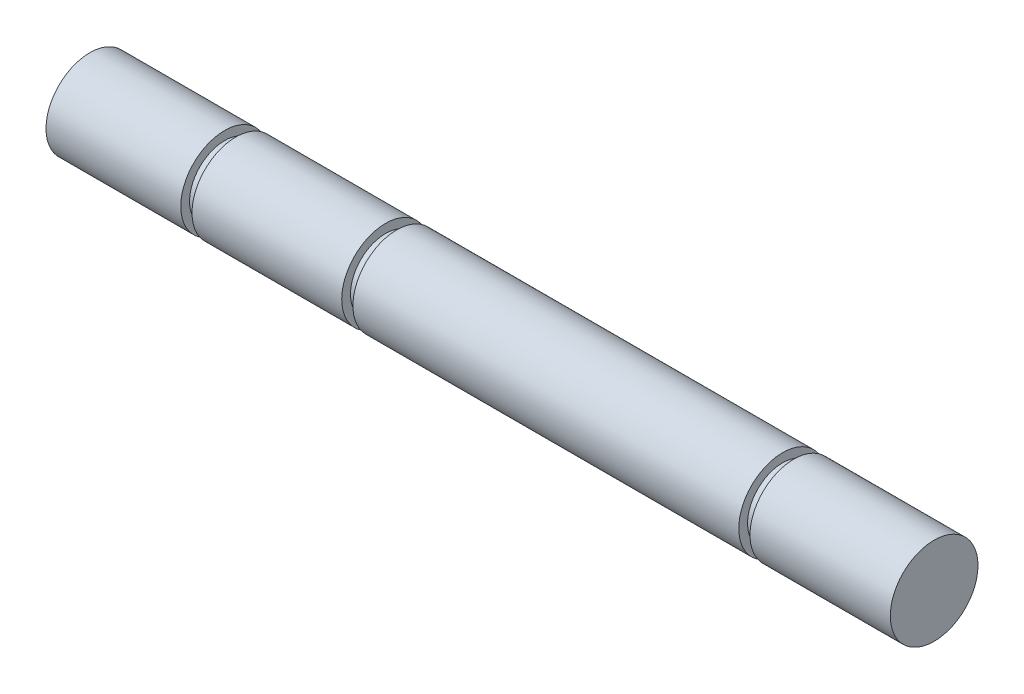
ISO-10303-21;
HEADER;
FILE_DESCRIPTION(('STEP AP214'),'2;1');
FILE_NAME('part.step','',(''),(''),'','','');
FILE_SCHEMA(('AUTOMOTIVE_DESIGN { 1 0 10303 214 1 1 1 1 }'));
ENDSEC;
DATA;
#1=APPLICATION_CONTEXT('core data for automotive mechanical design processes');
#2=APPLICATION_PROTOCOL_DEFINITION('international standard','automotive_design',2000,#1);
#3=PRODUCT_CONTEXT('',#1,'mechanical');
#4=PRODUCT('Part','Part','',(#3));
#5=PRODUCT_RELATED_PRODUCT_CATEGORY('part','',(#4));
#6=PRODUCT_DEFINITION_FORMATION('','',#4);
#7=PRODUCT_DEFINITION_CONTEXT('part definition',#1,'design');
#8=PRODUCT_DEFINITION('design','',#6,#7);
#9=PRODUCT_DEFINITION_SHAPE('','',#8);
#10=(LENGTH_UNIT() NAMED_UNIT(*) SI_UNIT(.MILLI.,.METRE.));
#11=(NAMED_UNIT(*) PLANE_ANGLE_UNIT() SI_UNIT($,.RADIAN.));
#12=(NAMED_UNIT(*) SI_UNIT($,.STERADIAN.) SOLID_ANGLE_UNIT());
#13=UNCERTAINTY_MEASURE_WITH_UNIT(LENGTH_MEASURE(1.E-05),#10,'distance_accuracy_value','');
#14=(GEOMETRIC_REPRESENTATION_CONTEXT(3) GLOBAL_UNCERTAINTY_ASSIGNED_CONTEXT((#13)) GLOBAL_UNIT_ASSIGNED_CONTEXT((#10,
#11,#12)) REPRESENTATION_CONTEXT('',''));
#15=CARTESIAN_POINT('',(0.,0.,0.));
#16=DIRECTION('',(0.,0.,1.));
#17=DIRECTION('',(1.,0.,0.));
#18=AXIS2_PLACEMENT_3D('',#15,#16,#17);
#19=CARTESIAN_POINT('',(100.,0.,0.));
#20=DIRECTION('',(-1.,0.,0.));
#21=DIRECTION('',(0.,0.,1.));
#22=AXIS2_PLACEMENT_3D('',#19,#20,#21);
#23=CYLINDRICAL_SURFACE('',#22,2.5);
#24=CARTESIAN_POINT('',(68.72,0.,0.));
#25=DIRECTION('',(1.,0.,0.));
#26=DIRECTION('',(0.,0.,-1.));
#27=AXIS2_PLACEMENT_3D('',#24,#25,#26);
#28=CIRCLE('',#27,2.5);
#29=CARTESIAN_POINT('',(68.72,0.,-2.5));
#30=VERTEX_POINT('',#29);
#31=EDGE_CURVE('E56',#30,#30,#28,.T.);
#32=ORIENTED_EDGE('',*,*,#31,.F.);
#33=EDGE_LOOP('',(#32));
#34=FACE_BOUND('',#33,.T.);
#35=CARTESIAN_POINT('',(60.185,0.,0.));
#36=DIRECTION('',(-1.,0.,0.));
#37=DIRECTION('',(0.,0.,1.));
#38=AXIS2_PLACEMENT_3D('',#35,#36,#37);
#39=CIRCLE('',#38,2.5);
#40=CARTESIAN_POINT('',(60.185,0.,2.5));
#41=VERTEX_POINT('',#40);
#42=EDGE_CURVE('E74',#41,#41,#39,.T.);
#43=ORIENTED_EDGE('',*,*,#42,.F.);
#44=EDGE_LOOP('',(#43));
#45=FACE_BOUND('',#44,.T.);
#46=ADVANCED_FACE('F35',(#34,#45),#23,.T.);
#47=CARTESIAN_POINT('',(69.36,0.,0.));
#48=DIRECTION('',(1.,0.,0.));
#49=DIRECTION('',(0.,0.,-1.));
#50=AXIS2_PLACEMENT_3D('',#47,#48,#49);
#51=CIRCLE('',#50,2.5);
#52=CARTESIAN_POINT('',(69.36,0.,-2.5));
#53=VERTEX_POINT('',#52);
#54=EDGE_CURVE('E59',#53,#53,#51,.T.);
#55=ORIENTED_EDGE('',*,*,#54,.T.);
#56=EDGE_LOOP('',(#55));
#57=FACE_BOUND('',#56,.T.);
#58=CARTESIAN_POINT('',(91.36,0.,0.));
#59=DIRECTION('',(1.,0.,0.));
#60=DIRECTION('',(0.,0.,-1.));
#61=AXIS2_PLACEMENT_3D('',#58,#59,#60);
#62=CIRCLE('',#61,2.5);
#63=CARTESIAN_POINT('',(91.36,0.,-2.5));
#64=VERTEX_POINT('',#63);
#65=EDGE_CURVE('E42',#64,#64,#62,.T.);
#66=ORIENTED_EDGE('',*,*,#65,.F.);
#67=EDGE_LOOP('',(#66));
#68=FACE_BOUND('',#67,.T.);
#69=ADVANCED_FACE('F107',(#57,#68),#23,.T.);
#70=CARTESIAN_POINT('',(91.36,0.,0.));
#71=DIRECTION('',(1.,0.,0.));
#72=DIRECTION('',(0.,0.,-1.));
#73=AXIS2_PLACEMENT_3D('',#70,#71,#72);
#74=PLANE('',#73);
#75=CARTESIAN_POINT('',(91.36,0.,0.));
#76=DIRECTION('',(1.,0.,0.));
#77=DIRECTION('',(0.,0.,-1.));
#78=AXIS2_PLACEMENT_3D('',#75,#76,#77);
#79=CIRCLE('',#78,2.);
#80=CARTESIAN_POINT('',(91.36,0.,-2.));
#81=VERTEX_POINT('',#80);
#82=EDGE_CURVE('E51',#81,#81,#79,.T.);
#83=ORIENTED_EDGE('',*,*,#82,.F.);
#84=EDGE_LOOP('',(#83));
#85=FACE_BOUND('',#84,.T.);
#86=ORIENTED_EDGE('',*,*,#65,.T.);
#87=EDGE_LOOP('',(#86));
#88=FACE_BOUND('',#87,.T.);
#89=ADVANCED_FACE('F113',(#85,#88),#74,.T.);
#90=CARTESIAN_POINT('',(92.,0.,0.));
#91=DIRECTION('',(1.,0.,0.));
#92=DIRECTION('',(0.,0.,-1.));
#93=AXIS2_PLACEMENT_3D('',#90,#91,#92);
#94=PLANE('',#93);
#95=CARTESIAN_POINT('',(92.,0.,0.));
#96=DIRECTION('',(1.,0.,0.));
#97=DIRECTION('',(0.,0.,-1.));
#98=AXIS2_PLACEMENT_3D('',#95,#96,#97);
#99=CIRCLE('',#98,2.);
#100=CARTESIAN_POINT('',(92.,0.,-2.));
#101=VERTEX_POINT('',#100);
#102=EDGE_CURVE('E53',#101,#101,#99,.T.);
#103=ORIENTED_EDGE('',*,*,#102,.T.);
#104=EDGE_LOOP('',(#103));
#105=FACE_BOUND('',#104,.T.);
#106=CARTESIAN_POINT('',(92.,0.,0.));
#107=DIRECTION('',(1.,0.,0.));
#108=DIRECTION('',(0.,0.,-1.));
#109=AXIS2_PLACEMENT_3D('',#106,#107,#108);
#110=CIRCLE('',#109,2.5);
#111=CARTESIAN_POINT('',(92.,0.,-2.5));
#112=VERTEX_POINT('',#111);
#113=EDGE_CURVE('E46',#112,#112,#110,.T.);
#114=ORIENTED_EDGE('',*,*,#113,.F.);
#115=EDGE_LOOP('',(#114));
#116=FACE_BOUND('',#115,.T.);
#117=ADVANCED_FACE('F134',(#105,#116),#94,.F.);
#118=CARTESIAN_POINT('',(91.36,0.,0.));
#119=DIRECTION('',(1.,0.,0.));
#120=DIRECTION('',(0.,0.,-1.));
#121=AXIS2_PLACEMENT_3D('',#118,#119,#120);
#122=CYLINDRICAL_SURFACE('',#121,2.);
#123=CARTESIAN_POINT('',(91.36,0.,-2.));
#124=CARTESIAN_POINT('',(91.3666666666666,0.,-2.));
#125=CARTESIAN_POINT('',(91.3733333333333,0.,-2.));
#126=CARTESIAN_POINT('',(91.3866666666667,0.,-2.));
#127=CARTESIAN_POINT('',(91.3933333333333,0.,-2.));
#128=CARTESIAN_POINT('',(91.4066666666667,0.,-2.));
#129=CARTESIAN_POINT('',(91.4133333333333,0.,-2.));
#130=CARTESIAN_POINT('',(91.4266666666667,0.,-2.));
#131=CARTESIAN_POINT('',(91.4333333333333,0.,-2.));
#132=CARTESIAN_POINT('',(91.4466666666667,0.,-2.));
#133=CARTESIAN_POINT('',(91.4533333333333,0.,-2.));
#134=CARTESIAN_POINT('',(91.4666666666667,0.,-2.));
#135=CARTESIAN_POINT('',(91.4733333333333,0.,-2.));
#136=CARTESIAN_POINT('',(91.4866666666667,0.,-2.));
#137=CARTESIAN_POINT('',(91.4933333333333,0.,-2.));
#138=CARTESIAN_POINT('',(91.5066666666666,0.,-2.));
#139=CARTESIAN_POINT('',(91.5133333333333,0.,-2.));
#140=CARTESIAN_POINT('',(91.5266666666667,0.,-2.));
#141=CARTESIAN_POINT('',(91.5333333333333,0.,-2.));
#142=CARTESIAN_POINT('',(91.5466666666667,0.,-2.));
#143=CARTESIAN_POINT('',(91.5533333333333,0.,-2.));
#144=CARTESIAN_POINT('',(91.5666666666667,0.,-2.));
#145=CARTESIAN_POINT('',(91.5733333333333,0.,-2.));
#146=CARTESIAN_POINT('',(91.5866666666667,0.,-2.));
#147=CARTESIAN_POINT('',(91.5933333333333,0.,-2.));
#148=CARTESIAN_POINT('',(91.6066666666667,0.,-2.));
#149=CARTESIAN_POINT('',(91.6133333333333,0.,-2.));
#150=CARTESIAN_POINT('',(91.6266666666667,0.,-2.));
#151=CARTESIAN_POINT('',(91.6333333333333,0.,-2.));
#152=CARTESIAN_POINT('',(91.6466666666666,0.,-2.));
#153=CARTESIAN_POINT('',(91.6533333333333,0.,-2.));
#154=CARTESIAN_POINT('',(91.6666666666667,0.,-2.));
#155=CARTESIAN_POINT('',(91.6733333333333,0.,-2.));
#156=CARTESIAN_POINT('',(91.6866666666667,0.,-2.));
#157=CARTESIAN_POINT('',(91.6933333333333,0.,-2.));
#158=CARTESIAN_POINT('',(91.7066666666667,0.,-2.));
#159=CARTESIAN_POINT('',(91.7133333333333,0.,-2.));
#160=CARTESIAN_POINT('',(91.7266666666667,0.,-2.));
#161=CARTESIAN_POINT('',(91.7333333333333,0.,-2.));
#162=CARTESIAN_POINT('',(91.7466666666667,0.,-2.));
#163=CARTESIAN_POINT('',(91.7533333333333,0.,-2.));
#164=CARTESIAN_POINT('',(91.7666666666667,0.,-2.));
#165=CARTESIAN_POINT('',(91.7733333333333,0.,-2.));
#166=CARTESIAN_POINT('',(91.7866666666667,0.,-2.));
#167=CARTESIAN_POINT('',(91.7933333333333,0.,-2.));
#168=CARTESIAN_POINT('',(91.8066666666667,0.,-2.));
#169=CARTESIAN_POINT('',(91.8133333333333,0.,-2.));
#170=CARTESIAN_POINT('',(91.8266666666667,0.,-2.));
#171=CARTESIAN_POINT('',(91.8333333333333,0.,-2.));
#172=CARTESIAN_POINT('',(91.8466666666667,0.,-2.));
#173=CARTESIAN_POINT('',(91.8533333333333,0.,-2.));
#174=CARTESIAN_POINT('',(91.8666666666667,0.,-2.));
#175=CARTESIAN_POINT('',(91.8733333333333,0.,-2.));
#176=CARTESIAN_POINT('',(91.8866666666667,0.,-2.));
#177=CARTESIAN_POINT('',(91.8933333333333,0.,-2.));
#178=CARTESIAN_POINT('',(91.9066666666667,0.,-2.));
#179=CARTESIAN_POINT('',(91.9133333333333,0.,-2.));
#180=CARTESIAN_POINT('',(91.9266666666667,0.,-2.));
#181=CARTESIAN_POINT('',(91.9333333333333,0.,-2.));
#182=CARTESIAN_POINT('',(91.9466666666667,0.,-2.));
#183=CARTESIAN_POINT('',(91.9533333333333,0.,-2.));
#184=CARTESIAN_POINT('',(91.9666666666667,0.,-2.));
#185=CARTESIAN_POINT('',(91.9733333333333,0.,-2.));
#186=CARTESIAN_POINT('',(91.9866666666667,0.,-2.));
#187=CARTESIAN_POINT('',(91.9933333333333,0.,-2.));
#188=CARTESIAN_POINT('',(92.,0.,-2.));
#189=B_SPLINE_CURVE_WITH_KNOTS('',3,(#123,#124,#125,#126,#127,#128,#129,#130,#131,#132,#133,
#134,#135,#136,#137,#138,#139,#140,#141,#142,#143,#144,#145,#146,#147,#148,#149,#150,#151,#152,
#153,#154,#155,#156,#157,#158,#159,#160,#161,#162,#163,#164,#165,#166,#167,#168,#169,#170,#171,
#172,#173,#174,#175,#176,#177,#178,#179,#180,#181,#182,#183,#184,#185,#186,#187,#188),
.UNSPECIFIED.,.F.,.F.,(4,2,2,2,2,2,2,2,2,2,2,2,2,2,2,2,2,2,2,2,2,2,2,2,2,2,2,2,2,2,2,2,4),(0.,
0.0200000000000061,0.0400000000000122,0.0600000000000045,0.0800000000000106,0.100000000000003,
0.120000000000009,0.140000000000001,0.160000000000007,0.180000000000013,0.200000000000006,
0.220000000000012,0.240000000000004,0.26000000000001,0.280000000000002,0.300000000000009,
0.320000000000001,0.340000000000007,0.360000000000013,0.380000000000005,0.400000000000011,
0.420000000000004,0.44000000000001,0.460000000000002,0.480000000000008,0.500000000000014,
0.520000000000007,0.540000000000013,0.560000000000005,0.580000000000011,0.600000000000003,
0.620000000000009,0.640000000000002),.UNSPECIFIED.);
#190=EDGE_CURVE('BSEAM130',#81,#101,#189,.T.);
#191=ORIENTED_EDGE('',*,*,#82,.T.);
#192=ORIENTED_EDGE('',*,*,#102,.F.);
#193=ORIENTED_EDGE('',*,*,#190,.T.);
#194=ORIENTED_EDGE('',*,*,#190,.F.);
#195=EDGE_LOOP('',(#191,#193,#192,#194));
#196=FACE_BOUND('',#195,.T.);
#197=ADVANCED_FACE('F130',(#196),#122,.T.);
#198=CARTESIAN_POINT('',(100.,0.,0.));
#199=DIRECTION('',(1.,0.,0.));
#200=DIRECTION('',(0.,0.,-1.));
#201=AXIS2_PLACEMENT_3D('',#198,#199,#200);
#202=PLANE('',#201);
#203=CARTESIAN_POINT('',(100.,0.,0.));
#204=DIRECTION('',(1.,0.,0.));
#205=DIRECTION('',(0.,0.,-1.));
#206=AXIS2_PLACEMENT_3D('',#203,#204,#205);
#207=CIRCLE('',#206,2.5);
#208=CARTESIAN_POINT('',(100.,0.,-2.5));
#209=VERTEX_POINT('',#208);
#210=EDGE_CURVE('E10',#209,#209,#207,.T.);
#211=ORIENTED_EDGE('',*,*,#210,.T.);
#212=EDGE_LOOP('',(#211));
#213=FACE_BOUND('',#212,.T.);
#214=ADVANCED_FACE('F121',(#213),#202,.T.);
#215=ORIENTED_EDGE('',*,*,#113,.T.);
#216=EDGE_LOOP('',(#215));
#217=FACE_BOUND('',#216,.T.);
#218=ORIENTED_EDGE('',*,*,#210,.F.);
#219=EDGE_LOOP('',(#218));
#220=FACE_BOUND('',#219,.T.);
#221=ADVANCED_FACE('F37',(#217,#220),#23,.T.);
#222=CARTESIAN_POINT('',(68.72,0.,0.));
#223=DIRECTION('',(1.,0.,0.));
#224=DIRECTION('',(0.,0.,-1.));
#225=AXIS2_PLACEMENT_3D('',#222,#223,#224);
#226=PLANE('',#225);
#227=CARTESIAN_POINT('',(68.72,0.,0.));
#228=DIRECTION('',(1.,0.,0.));
#229=DIRECTION('',(0.,0.,-1.));
#230=AXIS2_PLACEMENT_3D('',#227,#228,#229);
#231=CIRCLE('',#230,2.);
#232=CARTESIAN_POINT('',(68.72,0.,-2.));
#233=VERTEX_POINT('',#232);
#234=EDGE_CURVE('E62',#233,#233,#231,.T.);
#235=ORIENTED_EDGE('',*,*,#234,.F.);
#236=EDGE_LOOP('',(#235));
#237=FACE_BOUND('',#236,.T.);
#238=ORIENTED_EDGE('',*,*,#31,.T.);
#239=EDGE_LOOP('',(#238));
#240=FACE_BOUND('',#239,.T.);
#241=ADVANCED_FACE('F120',(#237,#240),#226,.T.);
#242=CARTESIAN_POINT('',(69.36,0.,0.));
#243=DIRECTION('',(1.,0.,0.));
#244=DIRECTION('',(0.,0.,-1.));
#245=AXIS2_PLACEMENT_3D('',#242,#243,#244);
#246=PLANE('',#245);
#247=CARTESIAN_POINT('',(69.36,0.,0.));
#248=DIRECTION('',(1.,0.,0.));
#249=DIRECTION('',(0.,0.,-1.));
#250=AXIS2_PLACEMENT_3D('',#247,#248,#249);
#251=CIRCLE('',#250,2.);
#252=CARTESIAN_POINT('',(69.36,0.,-2.));
#253=VERTEX_POINT('',#252);
#254=EDGE_CURVE('E65',#253,#253,#251,.T.);
#255=ORIENTED_EDGE('',*,*,#254,.T.);
#256=EDGE_LOOP('',(#255));
#257=FACE_BOUND('',#256,.T.);
#258=ORIENTED_EDGE('',*,*,#54,.F.);
#259=EDGE_LOOP('',(#258));
#260=FACE_BOUND('',#259,.T.);
#261=ADVANCED_FACE('F127',(#257,#260),#246,.F.);
#262=CARTESIAN_POINT('',(68.72,0.,0.));
#263=DIRECTION('',(1.,0.,0.));
#264=DIRECTION('',(0.,0.,-1.));
#265=AXIS2_PLACEMENT_3D('',#262,#263,#264);
#266=CYLINDRICAL_SURFACE('',#265,2.);
#267=CARTESIAN_POINT('',(68.72,0.,-2.));
#268=CARTESIAN_POINT('',(68.7266666666667,0.,-2.));
#269=CARTESIAN_POINT('',(68.7333333333333,0.,-2.));
#270=CARTESIAN_POINT('',(68.7466666666667,0.,-2.));
#271=CARTESIAN_POINT('',(68.7533333333333,0.,-2.));
#272=CARTESIAN_POINT('',(68.7666666666667,0.,-2.));
#273=CARTESIAN_POINT('',(68.7733333333333,0.,-2.));
#274=CARTESIAN_POINT('',(68.7866666666667,0.,-2.));
#275=CARTESIAN_POINT('',(68.7933333333333,0.,-2.));
#276=CARTESIAN_POINT('',(68.8066666666667,0.,-2.));
#277=CARTESIAN_POINT('',(68.8133333333333,0.,-2.));
#278=CARTESIAN_POINT('',(68.8266666666667,0.,-2.));
#279=CARTESIAN_POINT('',(68.8333333333333,0.,-2.));
#280=CARTESIAN_POINT('',(68.8466666666667,0.,-2.));
#281=CARTESIAN_POINT('',(68.8533333333333,0.,-2.));
#282=CARTESIAN_POINT('',(68.8666666666667,0.,-2.));
#283=CARTESIAN_POINT('',(68.8733333333333,0.,-2.));
#284=CARTESIAN_POINT('',(68.8866666666667,0.,-2.));
#285=CARTESIAN_POINT('',(68.8933333333333,0.,-2.));
#286=CARTESIAN_POINT('',(68.9066666666667,0.,-2.));
#287=CARTESIAN_POINT('',(68.9133333333333,0.,-2.));
#288=CARTESIAN_POINT('',(68.9266666666667,0.,-2.));
#289=CARTESIAN_POINT('',(68.9333333333333,0.,-2.));
#290=CARTESIAN_POINT('',(68.9466666666667,0.,-2.));
#291=CARTESIAN_POINT('',(68.9533333333333,0.,-2.));
#292=CARTESIAN_POINT('',(68.9666666666667,0.,-2.));
#293=CARTESIAN_POINT('',(68.9733333333333,0.,-2.));
#294=CARTESIAN_POINT('',(68.9866666666667,0.,-2.));
#295=CARTESIAN_POINT('',(68.9933333333333,0.,-2.));
#296=CARTESIAN_POINT('',(69.0066666666667,0.,-2.));
#297=CARTESIAN_POINT('',(69.0133333333333,0.,-2.));
#298=CARTESIAN_POINT('',(69.0266666666667,0.,-2.));
#299=CARTESIAN_POINT('',(69.0333333333333,0.,-2.));
#300=CARTESIAN_POINT('',(69.0466666666667,0.,-2.));
#301=CARTESIAN_POINT('',(69.0533333333333,0.,-2.));
#302=CARTESIAN_POINT('',(69.0666666666667,0.,-2.));
#303=CARTESIAN_POINT('',(69.0733333333333,0.,-2.));
#304=CARTESIAN_POINT('',(69.0866666666667,0.,-2.));
#305=CARTESIAN_POINT('',(69.0933333333333,0.,-2.));
#306=CARTESIAN_POINT('',(69.1066666666667,0.,-2.));
#307=CARTESIAN_POINT('',(69.1133333333333,0.,-2.));
#308=CARTESIAN_POINT('',(69.1266666666667,0.,-2.));
#309=CARTESIAN_POINT('',(69.1333333333333,0.,-2.));
#310=CARTESIAN_POINT('',(69.1466666666667,0.,-2.));
#311=CARTESIAN_POINT('',(69.1533333333333,0.,-2.));
#312=CARTESIAN_POINT('',(69.1666666666667,0.,-2.));
#313=CARTESIAN_POINT('',(69.1733333333333,0.,-2.));
#314=CARTESIAN_POINT('',(69.1866666666667,0.,-2.));
#315=CARTESIAN_POINT('',(69.1933333333333,0.,-2.));
#316=CARTESIAN_POINT('',(69.2066666666667,0.,-2.));
#317=CARTESIAN_POINT('',(69.2133333333333,0.,-2.));
#318=CARTESIAN_POINT('',(69.2266666666667,0.,-2.));
#319=CARTESIAN_POINT('',(69.2333333333333,0.,-2.));
#320=CARTESIAN_POINT('',(69.2466666666667,0.,-2.));
#321=CARTESIAN_POINT('',(69.2533333333333,0.,-2.));
#322=CARTESIAN_POINT('',(69.2666666666667,0.,-2.));
#323=CARTESIAN_POINT('',(69.2733333333333,0.,-2.));
#324=CARTESIAN_POINT('',(69.2866666666667,0.,-2.));
#325=CARTESIAN_POINT('',(69.2933333333333,0.,-2.));
#326=CARTESIAN_POINT('',(69.3066666666667,0.,-2.));
#327=CARTESIAN_POINT('',(69.3133333333333,0.,-2.));
#328=CARTESIAN_POINT('',(69.3266666666667,0.,-2.));
#329=CARTESIAN_POINT('',(69.3333333333333,0.,-2.));
#330=CARTESIAN_POINT('',(69.3466666666667,0.,-2.));
#331=CARTESIAN_POINT('',(69.3533333333333,0.,-2.));
#332=CARTESIAN_POINT('',(69.36,0.,-2.));
#333=B_SPLINE_CURVE_WITH_KNOTS('',3,(#267,#268,#269,#270,#271,#272,#273,#274,#275,#276,#277,
#278,#279,#280,#281,#282,#283,#284,#285,#286,#287,#288,#289,#290,#291,#292,#293,#294,#295,#296,
#297,#298,#299,#300,#301,#302,#303,#304,#305,#306,#307,#308,#309,#310,#311,#312,#313,#314,#315,
#316,#317,#318,#319,#320,#321,#322,#323,#324,#325,#326,#327,#328,#329,#330,#331,#332),
.UNSPECIFIED.,.F.,.F.,(4,2,2,2,2,2,2,2,2,2,2,2,2,2,2,2,2,2,2,2,2,2,2,2,2,2,2,2,2,2,2,2,4),(0.,
0.0200000000000061,0.0400000000000122,0.0600000000000045,0.0800000000000106,0.100000000000003,
0.120000000000009,0.140000000000001,0.160000000000007,0.180000000000013,0.200000000000006,
0.220000000000012,0.240000000000004,0.26000000000001,0.280000000000002,0.300000000000009,
0.320000000000001,0.340000000000007,0.360000000000013,0.380000000000005,0.400000000000011,
0.420000000000004,0.44000000000001,0.460000000000002,0.480000000000008,0.500000000000014,
0.520000000000007,0.540000000000013,0.560000000000005,0.580000000000011,0.600000000000003,
0.620000000000009,0.640000000000002),.UNSPECIFIED.);
#334=EDGE_CURVE('BSEAM102',#233,#253,#333,.T.);
#335=ORIENTED_EDGE('',*,*,#234,.T.);
#336=ORIENTED_EDGE('',*,*,#254,.F.);
#337=ORIENTED_EDGE('',*,*,#334,.T.);
#338=ORIENTED_EDGE('',*,*,#334,.F.);
#339=EDGE_LOOP('',(#335,#337,#336,#338));
#340=FACE_BOUND('',#339,.T.);
#341=ADVANCED_FACE('F102',(#340),#266,.T.);
#342=CARTESIAN_POINT('',(59.545,0.,0.));
#343=DIRECTION('',(-1.,0.,0.));
#344=DIRECTION('',(0.,0.,1.));
#345=AXIS2_PLACEMENT_3D('',#342,#343,#344);
#346=PLANE('',#345);
#347=CARTESIAN_POINT('',(59.545,0.,0.));
#348=DIRECTION('',(-1.,0.,0.));
#349=DIRECTION('',(0.,0.,1.));
#350=AXIS2_PLACEMENT_3D('',#347,#348,#349);
#351=CIRCLE('',#350,2.5);
#352=CARTESIAN_POINT('',(59.545,0.,2.5));
#353=VERTEX_POINT('',#352);
#354=EDGE_CURVE('E73',#353,#353,#351,.T.);
#355=ORIENTED_EDGE('',*,*,#354,.F.);
#356=EDGE_LOOP('',(#355));
#357=FACE_BOUND('',#356,.T.);
#358=CARTESIAN_POINT('',(59.545,0.,0.));
#359=DIRECTION('',(-1.,0.,0.));
#360=DIRECTION('',(0.,0.,1.));
#361=AXIS2_PLACEMENT_3D('',#358,#359,#360);
#362=CIRCLE('',#361,2.);
#363=CARTESIAN_POINT('',(59.545,0.,-2.));
#364=VERTEX_POINT('',#363);
#365=EDGE_CURVE('E77',#364,#364,#362,.T.);
#366=ORIENTED_EDGE('',*,*,#365,.T.);
#367=EDGE_LOOP('',(#366));
#368=FACE_BOUND('',#367,.T.);
#369=ADVANCED_FACE('F86',(#357,#368),#346,.F.);
#370=CARTESIAN_POINT('',(60.185,0.,0.));
#371=DIRECTION('',(-1.,0.,0.));
#372=DIRECTION('',(0.,0.,1.));
#373=AXIS2_PLACEMENT_3D('',#370,#371,#372);
#374=PLANE('',#373);
#375=ORIENTED_EDGE('',*,*,#42,.T.);
#376=EDGE_LOOP('',(#375));
#377=FACE_BOUND('',#376,.T.);
#378=CARTESIAN_POINT('',(60.185,0.,0.));
#379=DIRECTION('',(-1.,0.,0.));
#380=DIRECTION('',(0.,0.,1.));
#381=AXIS2_PLACEMENT_3D('',#378,#379,#380);
#382=CIRCLE('',#381,2.);
#383=CARTESIAN_POINT('',(60.185,0.,-2.));
#384=VERTEX_POINT('',#383);
#385=EDGE_CURVE('E80',#384,#384,#382,.T.);
#386=ORIENTED_EDGE('',*,*,#385,.F.);
#387=EDGE_LOOP('',(#386));
#388=FACE_BOUND('',#387,.T.);
#389=ADVANCED_FACE('F92',(#377,#388),#374,.T.);
#390=CARTESIAN_POINT('',(59.545,0.,0.));
#391=DIRECTION('',(1.,0.,0.));
#392=DIRECTION('',(0.,0.,-1.));
#393=AXIS2_PLACEMENT_3D('',#390,#391,#392);
#394=CYLINDRICAL_SURFACE('',#393,2.);
#395=CARTESIAN_POINT('',(59.545,0.,-2.));
#396=CARTESIAN_POINT('',(59.5516666666667,0.,-2.));
#397=CARTESIAN_POINT('',(59.5583333333333,0.,-2.));
#398=CARTESIAN_POINT('',(59.5716666666667,0.,-2.));
#399=CARTESIAN_POINT('',(59.5783333333333,0.,-2.));
#400=CARTESIAN_POINT('',(59.5916666666667,0.,-2.));
#401=CARTESIAN_POINT('',(59.5983333333333,0.,-2.));
#402=CARTESIAN_POINT('',(59.6116666666667,0.,-2.));
#403=CARTESIAN_POINT('',(59.6183333333333,0.,-2.));
#404=CARTESIAN_POINT('',(59.6316666666667,0.,-2.));
#405=CARTESIAN_POINT('',(59.6383333333333,0.,-2.));
#406=CARTESIAN_POINT('',(59.6516666666667,0.,-2.));
#407=CARTESIAN_POINT('',(59.6583333333333,0.,-2.));
#408=CARTESIAN_POINT('',(59.6716666666667,0.,-2.));
#409=CARTESIAN_POINT('',(59.6783333333333,0.,-2.));
#410=CARTESIAN_POINT('',(59.6916666666667,0.,-2.));
#411=CARTESIAN_POINT('',(59.6983333333333,0.,-2.));
#412=CARTESIAN_POINT('',(59.7116666666667,0.,-2.));
#413=CARTESIAN_POINT('',(59.7183333333333,0.,-2.));
#414=CARTESIAN_POINT('',(59.7316666666667,0.,-2.));
#415=CARTESIAN_POINT('',(59.7383333333333,0.,-2.));
#416=CARTESIAN_POINT('',(59.7516666666667,0.,-2.));
#417=CARTESIAN_POINT('',(59.7583333333333,0.,-2.));
#418=CARTESIAN_POINT('',(59.7716666666667,0.,-2.));
#419=CARTESIAN_POINT('',(59.7783333333333,0.,-2.));
#420=CARTESIAN_POINT('',(59.7916666666667,0.,-2.));
#421=CARTESIAN_POINT('',(59.7983333333333,0.,-2.));
#422=CARTESIAN_POINT('',(59.8116666666667,0.,-2.));
#423=CARTESIAN_POINT('',(59.8183333333333,0.,-2.));
#424=CARTESIAN_POINT('',(59.8316666666667,0.,-2.));
#425=CARTESIAN_POINT('',(59.8383333333333,0.,-2.));
#426=CARTESIAN_POINT('',(59.8516666666667,0.,-2.));
#427=CARTESIAN_POINT('',(59.8583333333333,0.,-2.));
#428=CARTESIAN_POINT('',(59.8716666666667,0.,-2.));
#429=CARTESIAN_POINT('',(59.8783333333333,0.,-2.));
#430=CARTESIAN_POINT('',(59.8916666666667,0.,-2.));
#431=CARTESIAN_POINT('',(59.8983333333333,0.,-2.));
#432=CARTESIAN_POINT('',(59.9116666666667,0.,-2.));
#433=CARTESIAN_POINT('',(59.9183333333333,0.,-2.));
#434=CARTESIAN_POINT('',(59.9316666666667,0.,-2.));
#435=CARTESIAN_POINT('',(59.9383333333333,0.,-2.));
#436=CARTESIAN_POINT('',(59.9516666666667,0.,-2.));
#437=CARTESIAN_POINT('',(59.9583333333333,0.,-2.));
#438=CARTESIAN_POINT('',(59.9716666666667,0.,-2.));
#439=CARTESIAN_POINT('',(59.9783333333333,0.,-2.));
#440=CARTESIAN_POINT('',(59.9916666666667,0.,-2.));
#441=CARTESIAN_POINT('',(59.9983333333333,0.,-2.));
#442=CARTESIAN_POINT('',(60.0116666666667,0.,-2.));
#443=CARTESIAN_POINT('',(60.0183333333333,0.,-2.));
#444=CARTESIAN_POINT('',(60.0316666666667,0.,-2.));
#445=CARTESIAN_POINT('',(60.0383333333333,0.,-2.));
#446=CARTESIAN_POINT('',(60.0516666666667,0.,-2.));
#447=CARTESIAN_POINT('',(60.0583333333333,0.,-2.));
#448=CARTESIAN_POINT('',(60.0716666666667,0.,-2.));
#449=CARTESIAN_POINT('',(60.0783333333333,0.,-2.));
#450=CARTESIAN_POINT('',(60.0916666666667,0.,-2.));
#451=CARTESIAN_POINT('',(60.0983333333333,0.,-2.));
#452=CARTESIAN_POINT('',(60.1116666666667,0.,-2.));
#453=CARTESIAN_POINT('',(60.1183333333333,0.,-2.));
#454=CARTESIAN_POINT('',(60.1316666666667,0.,-2.));
#455=CARTESIAN_POINT('',(60.1383333333333,0.,-2.));
#456=CARTESIAN_POINT('',(60.1516666666667,0.,-2.));
#457=CARTESIAN_POINT('',(60.1583333333333,0.,-2.));
#458=CARTESIAN_POINT('',(60.1716666666667,0.,-2.));
#459=CARTESIAN_POINT('',(60.1783333333333,0.,-2.));
#460=CARTESIAN_POINT('',(60.185,0.,-2.));
#461=B_SPLINE_CURVE_WITH_KNOTS('',3,(#395,#396,#397,#398,#399,#400,#401,#402,#403,#404,#405,
#406,#407,#408,#409,#410,#411,#412,#413,#414,#415,#416,#417,#418,#419,#420,#421,#422,#423,#424,
#425,#426,#427,#428,#429,#430,#431,#432,#433,#434,#435,#436,#437,#438,#439,#440,#441,#442,#443,
#444,#445,#446,#447,#448,#449,#450,#451,#452,#453,#454,#455,#456,#457,#458,#459,#460),
.UNSPECIFIED.,.F.,.F.,(4,2,2,2,2,2,2,2,2,2,2,2,2,2,2,2,2,2,2,2,2,2,2,2,2,2,2,2,2,2,2,2,4),(0.,
0.0199999999999992,0.0399999999999984,0.0599999999999976,0.0799999999999967,0.0999999999999959,
0.119999999999995,0.139999999999994,0.16,0.18,0.199999999999999,0.219999999999998,
0.239999999999997,0.259999999999996,0.279999999999996,0.299999999999995,0.320000000000001,0.34,
0.359999999999999,0.379999999999998,0.399999999999998,0.419999999999997,0.439999999999996,
0.459999999999995,0.480000000000001,0.5,0.52,0.539999999999999,0.559999999999998,
0.579999999999997,0.599999999999996,0.619999999999996,0.640000000000002),.UNSPECIFIED.);
#462=EDGE_CURVE('BSEAM88',#364,#384,#461,.T.);
#463=ORIENTED_EDGE('',*,*,#365,.F.);
#464=ORIENTED_EDGE('',*,*,#385,.T.);
#465=ORIENTED_EDGE('',*,*,#462,.T.);
#466=ORIENTED_EDGE('',*,*,#462,.F.);
#467=EDGE_LOOP('',(#463,#465,#464,#466));
#468=FACE_BOUND('',#467,.T.);
#469=ADVANCED_FACE('F88',(#468),#394,.T.);
#470=CARTESIAN_POINT('',(51.86,0.,0.));
#471=DIRECTION('',(-1.,0.,0.));
#472=DIRECTION('',(0.,0.,1.));
#473=AXIS2_PLACEMENT_3D('',#470,#471,#472);
#474=PLANE('',#473);
#475=CARTESIAN_POINT('',(51.86,0.,0.));
#476=DIRECTION('',(-1.,0.,0.));
#477=DIRECTION('',(0.,0.,1.));
#478=AXIS2_PLACEMENT_3D('',#475,#476,#477);
#479=CIRCLE('',#478,2.5);
#480=CARTESIAN_POINT('',(51.86,0.,2.5));
#481=VERTEX_POINT('',#480);
#482=EDGE_CURVE('E68',#481,#481,#479,.T.);
#483=ORIENTED_EDGE('',*,*,#482,.T.);
#484=EDGE_LOOP('',(#483));
#485=FACE_BOUND('',#484,.T.);
#486=ADVANCED_FACE('F91',(#485),#474,.T.);
#487=ORIENTED_EDGE('',*,*,#354,.T.);
#488=EDGE_LOOP('',(#487));
#489=FACE_BOUND('',#488,.T.);
#490=ORIENTED_EDGE('',*,*,#482,.F.);
#491=EDGE_LOOP('',(#490));
#492=FACE_BOUND('',#491,.T.);
#493=ADVANCED_FACE('F109',(#489,#492),#23,.T.);
#494=CLOSED_SHELL('',(#46,#69,#89,#117,#197,#214,#221,#241,#261,#341,#369,#389,#469,#486,#493));
#495=MANIFOLD_SOLID_BREP('B2',#494);
#496=ADVANCED_BREP_SHAPE_REPRESENTATION('',(#18,#495),#14);
#497=SHAPE_DEFINITION_REPRESENTATION(#9,#496);
ENDSEC;
END-ISO-10303-21;
